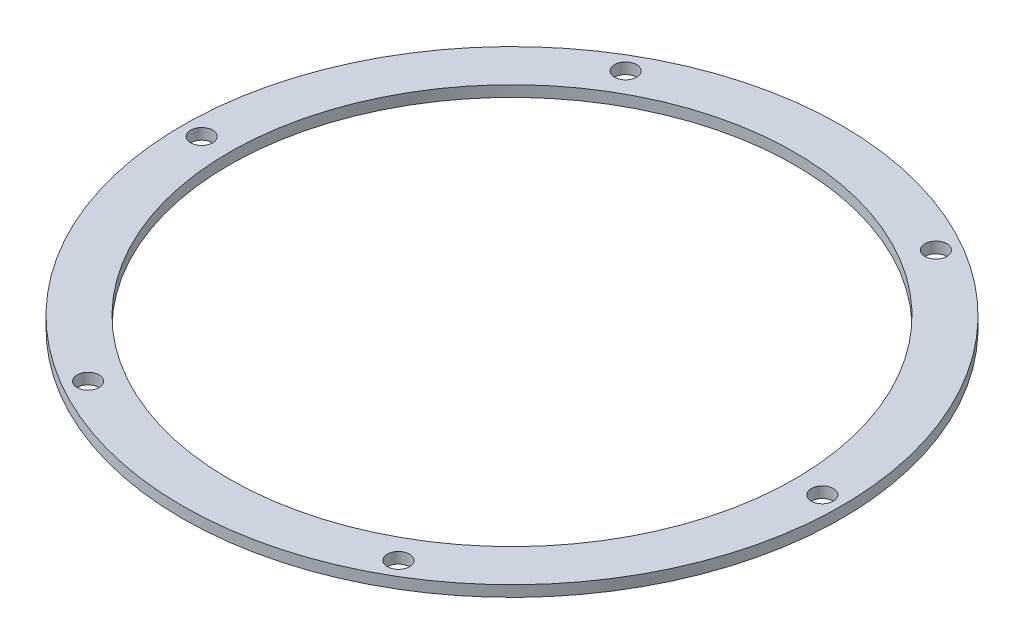
ISO-10303-21;
HEADER;
FILE_DESCRIPTION(('STEP AP214'),'2;1');
FILE_NAME('part.step','',(''),(''),'','','');
FILE_SCHEMA(('AUTOMOTIVE_DESIGN { 1 0 10303 214 1 1 1 1 }'));
ENDSEC;
DATA;
#1=APPLICATION_CONTEXT('core data for automotive mechanical design processes');
#2=APPLICATION_PROTOCOL_DEFINITION('international standard','automotive_design',2000,#1);
#3=PRODUCT_CONTEXT('',#1,'mechanical');
#4=PRODUCT('Part','Part','',(#3));
#5=PRODUCT_RELATED_PRODUCT_CATEGORY('part','',(#4));
#6=PRODUCT_DEFINITION_FORMATION('','',#4);
#7=PRODUCT_DEFINITION_CONTEXT('part definition',#1,'design');
#8=PRODUCT_DEFINITION('design','',#6,#7);
#9=PRODUCT_DEFINITION_SHAPE('','',#8);
#10=(LENGTH_UNIT() NAMED_UNIT(*) SI_UNIT(.MILLI.,.METRE.));
#11=(NAMED_UNIT(*) PLANE_ANGLE_UNIT() SI_UNIT($,.RADIAN.));
#12=(NAMED_UNIT(*) SI_UNIT($,.STERADIAN.) SOLID_ANGLE_UNIT());
#13=UNCERTAINTY_MEASURE_WITH_UNIT(LENGTH_MEASURE(1.E-05),#10,'distance_accuracy_value','');
#14=(GEOMETRIC_REPRESENTATION_CONTEXT(3) GLOBAL_UNCERTAINTY_ASSIGNED_CONTEXT((#13)) GLOBAL_UNIT_ASSIGNED_CONTEXT((#10,
#11,#12)) REPRESENTATION_CONTEXT('',''));
#15=CARTESIAN_POINT('',(0.,0.,0.));
#16=DIRECTION('',(0.,0.,1.));
#17=DIRECTION('',(1.,0.,0.));
#18=AXIS2_PLACEMENT_3D('',#15,#16,#17);
#19=CARTESIAN_POINT('',(0.,2.,0.));
#20=DIRECTION('',(0.,1.,0.));
#21=DIRECTION('',(0.,0.,1.));
#22=AXIS2_PLACEMENT_3D('',#19,#20,#21);
#23=PLANE('',#22);
#24=CARTESIAN_POINT('',(28.25,2.,48.9304353138208));
#25=DIRECTION('',(0.,1.,0.));
#26=DIRECTION('',(0.,0.,1.));
#27=AXIS2_PLACEMENT_3D('',#24,#25,#26);
#28=CIRCLE('',#27,2.);
#29=CARTESIAN_POINT('',(28.25,2.,50.9304353138208));
#30=VERTEX_POINT('',#29);
#31=EDGE_CURVE('E73',#30,#30,#28,.T.);
#32=ORIENTED_EDGE('',*,*,#31,.F.);
#33=EDGE_LOOP('',(#32));
#34=FACE_BOUND('',#33,.T.);
#35=CARTESIAN_POINT('',(-56.5,2.,0.));
#36=DIRECTION('',(0.,1.,0.));
#37=DIRECTION('',(0.,0.,1.));
#38=AXIS2_PLACEMENT_3D('',#35,#36,#37);
#39=CIRCLE('',#38,2.);
#40=CARTESIAN_POINT('',(-56.5,2.,2.00000000000004));
#41=VERTEX_POINT('',#40);
#42=EDGE_CURVE('E61',#41,#41,#39,.T.);
#43=ORIENTED_EDGE('',*,*,#42,.F.);
#44=EDGE_LOOP('',(#43));
#45=FACE_BOUND('',#44,.T.);
#46=CARTESIAN_POINT('',(-28.25,2.,48.9304353138208));
#47=DIRECTION('',(0.,1.,0.));
#48=DIRECTION('',(0.,0.,1.));
#49=AXIS2_PLACEMENT_3D('',#46,#47,#48);
#50=CIRCLE('',#49,2.);
#51=CARTESIAN_POINT('',(-28.25,2.,50.9304353138208));
#52=VERTEX_POINT('',#51);
#53=EDGE_CURVE('E49',#52,#52,#50,.T.);
#54=ORIENTED_EDGE('',*,*,#53,.F.);
#55=EDGE_LOOP('',(#54));
#56=FACE_BOUND('',#55,.T.);
#57=CARTESIAN_POINT('',(0.,2.,0.));
#58=DIRECTION('',(0.,1.,0.));
#59=DIRECTION('',(0.,0.,1.));
#60=AXIS2_PLACEMENT_3D('',#57,#58,#59);
#61=CIRCLE('',#60,60.);
#62=CARTESIAN_POINT('',(0.,2.,60.));
#63=VERTEX_POINT('',#62);
#64=EDGE_CURVE('E10',#63,#63,#61,.T.);
#65=ORIENTED_EDGE('',*,*,#64,.T.);
#66=EDGE_LOOP('',(#65));
#67=FACE_BOUND('',#66,.T.);
#68=CARTESIAN_POINT('',(-28.25,2.,-48.9304353138208));
#69=DIRECTION('',(0.,1.,0.));
#70=DIRECTION('',(0.,0.,1.));
#71=AXIS2_PLACEMENT_3D('',#68,#69,#70);
#72=CIRCLE('',#71,2.00000000000001);
#73=CARTESIAN_POINT('',(-28.25,2.,-46.9304353138208));
#74=VERTEX_POINT('',#73);
#75=EDGE_CURVE('E44',#74,#74,#72,.T.);
#76=ORIENTED_EDGE('',*,*,#75,.F.);
#77=EDGE_LOOP('',(#76));
#78=FACE_BOUND('',#77,.T.);
#79=CARTESIAN_POINT('',(28.25,2.,-48.9304353138208));
#80=DIRECTION('',(0.,1.,0.));
#81=DIRECTION('',(0.,0.,1.));
#82=AXIS2_PLACEMENT_3D('',#79,#80,#81);
#83=CIRCLE('',#82,2.00000000000001);
#84=CARTESIAN_POINT('',(28.25,2.,-46.9304353138208));
#85=VERTEX_POINT('',#84);
#86=EDGE_CURVE('E55',#85,#85,#83,.T.);
#87=ORIENTED_EDGE('',*,*,#86,.F.);
#88=EDGE_LOOP('',(#87));
#89=FACE_BOUND('',#88,.T.);
#90=CARTESIAN_POINT('',(56.5,2.,0.));
#91=DIRECTION('',(0.,1.,0.));
#92=DIRECTION('',(0.,0.,1.));
#93=AXIS2_PLACEMENT_3D('',#90,#91,#92);
#94=CIRCLE('',#93,2.);
#95=CARTESIAN_POINT('',(56.5,2.,2.));
#96=VERTEX_POINT('',#95);
#97=EDGE_CURVE('E67',#96,#96,#94,.T.);
#98=ORIENTED_EDGE('',*,*,#97,.F.);
#99=EDGE_LOOP('',(#98));
#100=FACE_BOUND('',#99,.T.);
#101=CARTESIAN_POINT('',(0.,2.,0.));
#102=DIRECTION('',(0.,1.,0.));
#103=DIRECTION('',(0.,0.,1.));
#104=AXIS2_PLACEMENT_3D('',#101,#102,#103);
#105=CIRCLE('',#104,51.5);
#106=CARTESIAN_POINT('',(0.,2.,51.5));
#107=VERTEX_POINT('',#106);
#108=EDGE_CURVE('E79',#107,#107,#105,.T.);
#109=ORIENTED_EDGE('',*,*,#108,.F.);
#110=EDGE_LOOP('',(#109));
#111=FACE_BOUND('',#110,.T.);
#112=ADVANCED_FACE('F33',(#34,#45,#56,#67,#78,#89,#100,#111),#23,.T.);
#113=CARTESIAN_POINT('',(0.,0.,0.));
#114=DIRECTION('',(0.,1.,0.));
#115=DIRECTION('',(0.,0.,1.));
#116=AXIS2_PLACEMENT_3D('',#113,#114,#115);
#117=PLANE('',#116);
#118=CARTESIAN_POINT('',(0.,0.,0.));
#119=DIRECTION('',(0.,1.,0.));
#120=DIRECTION('',(0.,0.,1.));
#121=AXIS2_PLACEMENT_3D('',#118,#119,#120);
#122=CIRCLE('',#121,60.);
#123=CARTESIAN_POINT('',(0.,0.,60.));
#124=VERTEX_POINT('',#123);
#125=EDGE_CURVE('E37',#124,#124,#122,.T.);
#126=ORIENTED_EDGE('',*,*,#125,.F.);
#127=EDGE_LOOP('',(#126));
#128=FACE_BOUND('',#127,.T.);
#129=CARTESIAN_POINT('',(-28.25,0.,-48.9304353138208));
#130=DIRECTION('',(0.,1.,0.));
#131=DIRECTION('',(0.,0.,1.));
#132=AXIS2_PLACEMENT_3D('',#129,#130,#131);
#133=CIRCLE('',#132,2.00000000000001);
#134=CARTESIAN_POINT('',(-28.25,0.,-46.9304353138208));
#135=VERTEX_POINT('',#134);
#136=EDGE_CURVE('E46',#135,#135,#133,.T.);
#137=ORIENTED_EDGE('',*,*,#136,.T.);
#138=EDGE_LOOP('',(#137));
#139=FACE_BOUND('',#138,.T.);
#140=CARTESIAN_POINT('',(-28.25,0.,48.9304353138208));
#141=DIRECTION('',(0.,1.,0.));
#142=DIRECTION('',(0.,0.,1.));
#143=AXIS2_PLACEMENT_3D('',#140,#141,#142);
#144=CIRCLE('',#143,2.);
#145=CARTESIAN_POINT('',(-28.25,0.,50.9304353138208));
#146=VERTEX_POINT('',#145);
#147=EDGE_CURVE('E52',#146,#146,#144,.T.);
#148=ORIENTED_EDGE('',*,*,#147,.T.);
#149=EDGE_LOOP('',(#148));
#150=FACE_BOUND('',#149,.T.);
#151=CARTESIAN_POINT('',(28.25,0.,-48.9304353138208));
#152=DIRECTION('',(0.,1.,0.));
#153=DIRECTION('',(0.,0.,1.));
#154=AXIS2_PLACEMENT_3D('',#151,#152,#153);
#155=CIRCLE('',#154,2.00000000000001);
#156=CARTESIAN_POINT('',(28.25,0.,-46.9304353138208));
#157=VERTEX_POINT('',#156);
#158=EDGE_CURVE('E58',#157,#157,#155,.T.);
#159=ORIENTED_EDGE('',*,*,#158,.T.);
#160=EDGE_LOOP('',(#159));
#161=FACE_BOUND('',#160,.T.);
#162=CARTESIAN_POINT('',(-56.5,0.,0.));
#163=DIRECTION('',(0.,1.,0.));
#164=DIRECTION('',(0.,0.,1.));
#165=AXIS2_PLACEMENT_3D('',#162,#163,#164);
#166=CIRCLE('',#165,2.);
#167=CARTESIAN_POINT('',(-56.5,0.,2.00000000000004));
#168=VERTEX_POINT('',#167);
#169=EDGE_CURVE('E64',#168,#168,#166,.T.);
#170=ORIENTED_EDGE('',*,*,#169,.T.);
#171=EDGE_LOOP('',(#170));
#172=FACE_BOUND('',#171,.T.);
#173=CARTESIAN_POINT('',(56.5,0.,0.));
#174=DIRECTION('',(0.,1.,0.));
#175=DIRECTION('',(0.,0.,1.));
#176=AXIS2_PLACEMENT_3D('',#173,#174,#175);
#177=CIRCLE('',#176,2.);
#178=CARTESIAN_POINT('',(56.5,0.,2.));
#179=VERTEX_POINT('',#178);
#180=EDGE_CURVE('E70',#179,#179,#177,.T.);
#181=ORIENTED_EDGE('',*,*,#180,.T.);
#182=EDGE_LOOP('',(#181));
#183=FACE_BOUND('',#182,.T.);
#184=CARTESIAN_POINT('',(28.25,0.,48.9304353138208));
#185=DIRECTION('',(0.,1.,0.));
#186=DIRECTION('',(0.,0.,1.));
#187=AXIS2_PLACEMENT_3D('',#184,#185,#186);
#188=CIRCLE('',#187,2.);
#189=CARTESIAN_POINT('',(28.25,0.,50.9304353138208));
#190=VERTEX_POINT('',#189);
#191=EDGE_CURVE('E76',#190,#190,#188,.T.);
#192=ORIENTED_EDGE('',*,*,#191,.T.);
#193=EDGE_LOOP('',(#192));
#194=FACE_BOUND('',#193,.T.);
#195=CARTESIAN_POINT('',(0.,0.,0.));
#196=DIRECTION('',(0.,1.,0.));
#197=DIRECTION('',(0.,0.,1.));
#198=AXIS2_PLACEMENT_3D('',#195,#196,#197);
#199=CIRCLE('',#198,51.5);
#200=CARTESIAN_POINT('',(0.,0.,51.5));
#201=VERTEX_POINT('',#200);
#202=EDGE_CURVE('E82',#201,#201,#199,.T.);
#203=ORIENTED_EDGE('',*,*,#202,.T.);
#204=EDGE_LOOP('',(#203));
#205=FACE_BOUND('',#204,.T.);
#206=ADVANCED_FACE('F92',(#128,#139,#150,#161,#172,#183,#194,#205),#117,.F.);
#207=CARTESIAN_POINT('',(0.,2.,0.));
#208=DIRECTION('',(0.,-1.,0.));
#209=DIRECTION('',(0.,0.,-1.));
#210=AXIS2_PLACEMENT_3D('',#207,#208,#209);
#211=CYLINDRICAL_SURFACE('',#210,60.);
#212=ORIENTED_EDGE('',*,*,#64,.F.);
#213=EDGE_LOOP('',(#212));
#214=FACE_BOUND('',#213,.T.);
#215=ORIENTED_EDGE('',*,*,#125,.T.);
#216=EDGE_LOOP('',(#215));
#217=FACE_BOUND('',#216,.T.);
#218=ADVANCED_FACE('F35',(#214,#217),#211,.T.);
#219=CARTESIAN_POINT('',(-28.25,2.,-48.9304353138208));
#220=DIRECTION('',(0.,-1.,0.));
#221=DIRECTION('',(0.,0.,-1.));
#222=AXIS2_PLACEMENT_3D('',#219,#220,#221);
#223=CYLINDRICAL_SURFACE('',#222,2.00000000000001);
#224=ORIENTED_EDGE('',*,*,#75,.T.);
#225=EDGE_LOOP('',(#224));
#226=FACE_BOUND('',#225,.T.);
#227=ORIENTED_EDGE('',*,*,#136,.F.);
#228=EDGE_LOOP('',(#227));
#229=FACE_BOUND('',#228,.T.);
#230=ADVANCED_FACE('F102',(#226,#229),#223,.F.);
#231=CARTESIAN_POINT('',(-28.25,2.,48.9304353138208));
#232=DIRECTION('',(0.,-1.,0.));
#233=DIRECTION('',(0.,0.,-1.));
#234=AXIS2_PLACEMENT_3D('',#231,#232,#233);
#235=CYLINDRICAL_SURFACE('',#234,2.);
#236=ORIENTED_EDGE('',*,*,#53,.T.);
#237=EDGE_LOOP('',(#236));
#238=FACE_BOUND('',#237,.T.);
#239=ORIENTED_EDGE('',*,*,#147,.F.);
#240=EDGE_LOOP('',(#239));
#241=FACE_BOUND('',#240,.T.);
#242=ADVANCED_FACE('F105',(#238,#241),#235,.F.);
#243=CARTESIAN_POINT('',(28.25,2.,-48.9304353138208));
#244=DIRECTION('',(0.,-1.,0.));
#245=DIRECTION('',(0.,0.,-1.));
#246=AXIS2_PLACEMENT_3D('',#243,#244,#245);
#247=CYLINDRICAL_SURFACE('',#246,2.00000000000001);
#248=ORIENTED_EDGE('',*,*,#86,.T.);
#249=EDGE_LOOP('',(#248));
#250=FACE_BOUND('',#249,.T.);
#251=ORIENTED_EDGE('',*,*,#158,.F.);
#252=EDGE_LOOP('',(#251));
#253=FACE_BOUND('',#252,.T.);
#254=ADVANCED_FACE('F109',(#250,#253),#247,.F.);
#255=CARTESIAN_POINT('',(-56.5,2.,0.));
#256=DIRECTION('',(0.,-1.,0.));
#257=DIRECTION('',(0.,0.,-1.));
#258=AXIS2_PLACEMENT_3D('',#255,#256,#257);
#259=CYLINDRICAL_SURFACE('',#258,2.);
#260=ORIENTED_EDGE('',*,*,#42,.T.);
#261=EDGE_LOOP('',(#260));
#262=FACE_BOUND('',#261,.T.);
#263=ORIENTED_EDGE('',*,*,#169,.F.);
#264=EDGE_LOOP('',(#263));
#265=FACE_BOUND('',#264,.T.);
#266=ADVANCED_FACE('F113',(#262,#265),#259,.F.);
#267=CARTESIAN_POINT('',(56.5,2.,0.));
#268=DIRECTION('',(0.,-1.,0.));
#269=DIRECTION('',(0.,0.,-1.));
#270=AXIS2_PLACEMENT_3D('',#267,#268,#269);
#271=CYLINDRICAL_SURFACE('',#270,2.);
#272=ORIENTED_EDGE('',*,*,#97,.T.);
#273=EDGE_LOOP('',(#272));
#274=FACE_BOUND('',#273,.T.);
#275=ORIENTED_EDGE('',*,*,#180,.F.);
#276=EDGE_LOOP('',(#275));
#277=FACE_BOUND('',#276,.T.);
#278=ADVANCED_FACE('F117',(#274,#277),#271,.F.);
#279=CARTESIAN_POINT('',(28.25,2.,48.9304353138208));
#280=DIRECTION('',(0.,-1.,0.));
#281=DIRECTION('',(0.,0.,-1.));
#282=AXIS2_PLACEMENT_3D('',#279,#280,#281);
#283=CYLINDRICAL_SURFACE('',#282,2.);
#284=ORIENTED_EDGE('',*,*,#31,.T.);
#285=EDGE_LOOP('',(#284));
#286=FACE_BOUND('',#285,.T.);
#287=ORIENTED_EDGE('',*,*,#191,.F.);
#288=EDGE_LOOP('',(#287));
#289=FACE_BOUND('',#288,.T.);
#290=ADVANCED_FACE('F121',(#286,#289),#283,.F.);
#291=CARTESIAN_POINT('',(0.,2.,0.));
#292=DIRECTION('',(0.,-1.,0.));
#293=DIRECTION('',(0.,0.,-1.));
#294=AXIS2_PLACEMENT_3D('',#291,#292,#293);
#295=CYLINDRICAL_SURFACE('',#294,51.5);
#296=ORIENTED_EDGE('',*,*,#108,.T.);
#297=EDGE_LOOP('',(#296));
#298=FACE_BOUND('',#297,.T.);
#299=ORIENTED_EDGE('',*,*,#202,.F.);
#300=EDGE_LOOP('',(#299));
#301=FACE_BOUND('',#300,.T.);
#302=ADVANCED_FACE('F88',(#298,#301),#295,.F.);
#303=CLOSED_SHELL('',(#112,#206,#218,#230,#242,#254,#266,#278,#290,#302));
#304=MANIFOLD_SOLID_BREP('B2',#303);
#305=ADVANCED_BREP_SHAPE_REPRESENTATION('',(#18,#304),#14);
#306=SHAPE_DEFINITION_REPRESENTATION(#9,#305);
ENDSEC;
END-ISO-10303-21;
